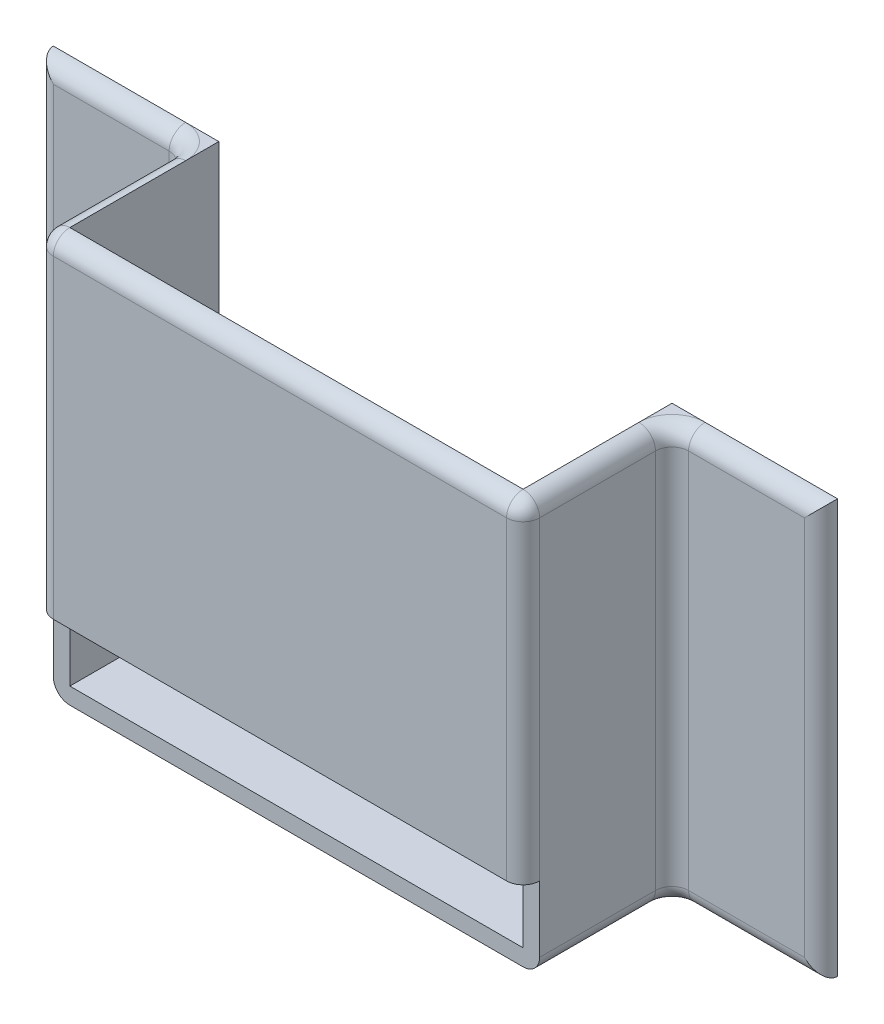
ISO-10303-21;
HEADER;
FILE_DESCRIPTION(('STEP AP214'),'2;1');
FILE_NAME('part.step','',(''),(''),'','','');
FILE_SCHEMA(('AUTOMOTIVE_DESIGN { 1 0 10303 214 1 1 1 1 }'));
ENDSEC;
DATA;
#1=APPLICATION_CONTEXT('core data for automotive mechanical design processes');
#2=APPLICATION_PROTOCOL_DEFINITION('international standard','automotive_design',2000,#1);
#3=PRODUCT_CONTEXT('',#1,'mechanical');
#4=PRODUCT('Part','Part','',(#3));
#5=PRODUCT_RELATED_PRODUCT_CATEGORY('part','',(#4));
#6=PRODUCT_DEFINITION_FORMATION('','',#4);
#7=PRODUCT_DEFINITION_CONTEXT('part definition',#1,'design');
#8=PRODUCT_DEFINITION('design','',#6,#7);
#9=PRODUCT_DEFINITION_SHAPE('','',#8);
#10=(LENGTH_UNIT() NAMED_UNIT(*) SI_UNIT(.MILLI.,.METRE.));
#11=(NAMED_UNIT(*) PLANE_ANGLE_UNIT() SI_UNIT($,.RADIAN.));
#12=(NAMED_UNIT(*) SI_UNIT($,.STERADIAN.) SOLID_ANGLE_UNIT());
#13=UNCERTAINTY_MEASURE_WITH_UNIT(LENGTH_MEASURE(1.E-05),#10,'distance_accuracy_value','');
#14=(GEOMETRIC_REPRESENTATION_CONTEXT(3) GLOBAL_UNCERTAINTY_ASSIGNED_CONTEXT((#13)) GLOBAL_UNIT_ASSIGNED_CONTEXT((#10,
#11,#12)) REPRESENTATION_CONTEXT('',''));
#15=CARTESIAN_POINT('',(0.,0.,0.));
#16=DIRECTION('',(0.,0.,1.));
#17=DIRECTION('',(1.,0.,0.));
#18=AXIS2_PLACEMENT_3D('',#15,#16,#17);
#19=CARTESIAN_POINT('',(-53.4725742168634,-14.9337819884934,2.54));
#20=DIRECTION('',(0.,1.,0.));
#21=DIRECTION('',(0.,0.,1.));
#22=AXIS2_PLACEMENT_3D('',#19,#20,#21);
#23=PLANE('',#22);
#24=CARTESIAN_POINT('',(-33.1525742168634,-14.9337819884934,-17.78));
#25=DIRECTION('',(0.,1.,0.));
#26=DIRECTION('',(0.,0.,1.));
#27=AXIS2_PLACEMENT_3D('',#24,#25,#26);
#28=CIRCLE('',#27,5.08);
#29=CARTESIAN_POINT('',(-33.1525742168634,-14.9337819884934,-22.86));
#30=VERTEX_POINT('',#29);
#31=CARTESIAN_POINT('',(-28.0725742168634,-14.9337819884934,-17.78));
#32=VERTEX_POINT('',#31);
#33=EDGE_CURVE('E356',#30,#32,#28,.F.);
#34=ORIENTED_EDGE('',*,*,#33,.F.);
#35=DIRECTION('',(-1.,0.,0.));
#36=VECTOR('',#35,1.);
#37=CARTESIAN_POINT('',(66.8980257831366,-14.9337819884934,-22.86));
#38=LINE('',#37,#36);
#39=CARTESIAN_POINT('',(46.5780257831366,-14.9337819884934,-22.86));
#40=VERTEX_POINT('',#39);
#41=EDGE_CURVE('E307',#40,#30,#38,.T.);
#42=ORIENTED_EDGE('',*,*,#41,.F.);
#43=CARTESIAN_POINT('',(46.5780257831366,-14.9337819884934,-17.78));
#44=DIRECTION('',(0.,1.,0.));
#45=DIRECTION('',(0.,0.,1.));
#46=AXIS2_PLACEMENT_3D('',#43,#44,#45);
#47=CIRCLE('',#46,5.08);
#48=CARTESIAN_POINT('',(41.4980257831366,-14.9337819884934,-17.78));
#49=VERTEX_POINT('',#48);
#50=EDGE_CURVE('E348',#49,#40,#47,.F.);
#51=ORIENTED_EDGE('',*,*,#50,.F.);
#52=DIRECTION('',(0.,0.,1.));
#53=VECTOR('',#52,1.);
#54=CARTESIAN_POINT('',(41.4980257831366,-14.9337819884934,2.54));
#55=LINE('',#54,#53);
#56=CARTESIAN_POINT('',(41.4980257831366,-14.9337819884934,0.));
#57=VERTEX_POINT('',#56);
#58=EDGE_CURVE('E345',#49,#57,#55,.T.);
#59=ORIENTED_EDGE('',*,*,#58,.T.);
#60=DIRECTION('',(1.,0.,0.));
#61=VECTOR('',#60,1.);
#62=CARTESIAN_POINT('',(-30.6125742168634,-14.9337819884934,0.));
#63=LINE('',#62,#61);
#64=CARTESIAN_POINT('',(-28.0725742168634,-14.9337819884934,0.));
#65=VERTEX_POINT('',#64);
#66=EDGE_CURVE('E351',#57,#65,#63,.F.);
#67=ORIENTED_EDGE('',*,*,#66,.T.);
#68=DIRECTION('',(0.,0.,-1.));
#69=VECTOR('',#68,1.);
#70=CARTESIAN_POINT('',(-28.0725742168634,-14.9337819884934,2.54));
#71=LINE('',#70,#69);
#72=EDGE_CURVE('E354',#65,#32,#71,.T.);
#73=ORIENTED_EDGE('',*,*,#72,.T.);
#74=EDGE_LOOP('',(#34,#42,#51,#59,#67,#73));
#75=FACE_BOUND('',#74,.T.);
#76=ADVANCED_FACE('F35',(#75),#23,.F.);
#77=CARTESIAN_POINT('',(-53.4725742168634,48.5662180115066,2.54));
#78=DIRECTION('',(0.,-1.,0.));
#79=DIRECTION('',(0.,0.,-1.));
#80=AXIS2_PLACEMENT_3D('',#77,#78,#79);
#81=PLANE('',#80);
#82=CARTESIAN_POINT('',(-33.1525742168634,48.5662180115066,-17.78));
#83=DIRECTION('',(0.,-1.,0.));
#84=DIRECTION('',(0.,0.,-1.));
#85=AXIS2_PLACEMENT_3D('',#82,#83,#84);
#86=CIRCLE('',#85,5.08);
#87=CARTESIAN_POINT('',(-28.0725742168634,48.5662180115066,-17.78));
#88=VERTEX_POINT('',#87);
#89=CARTESIAN_POINT('',(-33.1525742168634,48.5662180115066,-22.86));
#90=VERTEX_POINT('',#89);
#91=EDGE_CURVE('E321',#88,#90,#86,.F.);
#92=ORIENTED_EDGE('',*,*,#91,.F.);
#93=DIRECTION('',(0.,0.,1.));
#94=VECTOR('',#93,1.);
#95=CARTESIAN_POINT('',(-28.0725742168634,48.5662180115066,-22.86));
#96=LINE('',#95,#94);
#97=CARTESIAN_POINT('',(-28.0725742168634,48.5662180115066,-22.86));
#98=VERTEX_POINT('',#97);
#99=EDGE_CURVE('E414',#98,#88,#96,.T.);
#100=ORIENTED_EDGE('',*,*,#99,.F.);
#101=DIRECTION('',(1.,0.,0.));
#102=VECTOR('',#101,1.);
#103=CARTESIAN_POINT('',(0.,48.5662180115066,-22.86));
#104=LINE('',#103,#102);
#105=EDGE_CURVE('E423',#90,#98,#104,.T.);
#106=ORIENTED_EDGE('',*,*,#105,.F.);
#107=EDGE_LOOP('',(#92,#100,#106));
#108=FACE_BOUND('',#107,.T.);
#109=ADVANCED_FACE('F475',(#108),#81,.F.);
#110=CARTESIAN_POINT('',(46.5780257831366,48.5662180115066,-17.78));
#111=DIRECTION('',(0.,-1.,0.));
#112=DIRECTION('',(0.,0.,-1.));
#113=AXIS2_PLACEMENT_3D('',#110,#111,#112);
#114=CIRCLE('',#113,5.08);
#115=CARTESIAN_POINT('',(46.5780257831366,48.5662180115066,-22.86));
#116=VERTEX_POINT('',#115);
#117=CARTESIAN_POINT('',(41.4980257831366,48.5662180115066,-17.78));
#118=VERTEX_POINT('',#117);
#119=EDGE_CURVE('E317',#116,#118,#114,.F.);
#120=ORIENTED_EDGE('',*,*,#119,.F.);
#121=DIRECTION('',(1.,0.,0.));
#122=VECTOR('',#121,1.);
#123=CARTESIAN_POINT('',(0.,48.5662180115066,-22.86));
#124=LINE('',#123,#122);
#125=CARTESIAN_POINT('',(41.4980257831366,48.5662180115066,-22.86));
#126=VERTEX_POINT('',#125);
#127=EDGE_CURVE('E408',#126,#116,#124,.T.);
#128=ORIENTED_EDGE('',*,*,#127,.F.);
#129=DIRECTION('',(0.,0.,1.));
#130=VECTOR('',#129,1.);
#131=CARTESIAN_POINT('',(41.4980257831366,48.5662180115066,-22.86));
#132=LINE('',#131,#130);
#133=EDGE_CURVE('E318',#126,#118,#132,.T.);
#134=ORIENTED_EDGE('',*,*,#133,.T.);
#135=EDGE_LOOP('',(#120,#128,#134));
#136=FACE_BOUND('',#135,.T.);
#137=ADVANCED_FACE('F497',(#136),#81,.F.);
#138=CARTESIAN_POINT('',(44.0380257831366,48.5662180115066,2.54));
#139=DIRECTION('',(-1.,0.,0.));
#140=DIRECTION('',(0.,-1.,0.));
#141=AXIS2_PLACEMENT_3D('',#138,#139,#140);
#142=PLANE('',#141);
#143=DIRECTION('',(0.,-1.,0.));
#144=VECTOR('',#143,1.);
#145=CARTESIAN_POINT('',(44.0380257831366,48.5662180115066,-17.78));
#146=LINE('',#145,#144);
#147=CARTESIAN_POINT('',(44.0380257831366,-12.3937819884934,-17.78));
#148=VERTEX_POINT('',#147);
#149=CARTESIAN_POINT('',(44.0380257831366,46.0262180115066,-17.78));
#150=VERTEX_POINT('',#149);
#151=EDGE_CURVE('E225',#148,#150,#146,.F.);
#152=ORIENTED_EDGE('',*,*,#151,.T.);
#153=DIRECTION('',(0.,0.,-1.));
#154=VECTOR('',#153,1.);
#155=CARTESIAN_POINT('',(44.0380257831366,46.0262180115066,2.54));
#156=LINE('',#155,#154);
#157=CARTESIAN_POINT('',(44.0380257831366,46.0262180115066,0.));
#158=VERTEX_POINT('',#157);
#159=EDGE_CURVE('E224',#150,#158,#156,.F.);
#160=ORIENTED_EDGE('',*,*,#159,.T.);
#161=DIRECTION('',(0.,1.,0.));
#162=VECTOR('',#161,1.);
#163=CARTESIAN_POINT('',(44.0380257831366,-14.9337819884934,0.));
#164=LINE('',#163,#162);
#165=CARTESIAN_POINT('',(44.0380257831366,-2.23378198849342,0.));
#166=VERTEX_POINT('',#165);
#167=EDGE_CURVE('E216',#158,#166,#164,.F.);
#168=ORIENTED_EDGE('',*,*,#167,.T.);
#169=DIRECTION('',(0.,-1.,0.));
#170=VECTOR('',#169,1.);
#171=CARTESIAN_POINT('',(44.0380257831366,0.,0.));
#172=LINE('',#171,#170);
#173=CARTESIAN_POINT('',(44.0380257831366,-12.3937819884934,0.));
#174=VERTEX_POINT('',#173);
#175=EDGE_CURVE('E189',#174,#166,#172,.F.);
#176=ORIENTED_EDGE('',*,*,#175,.F.);
#177=DIRECTION('',(0.,0.,1.));
#178=VECTOR('',#177,1.);
#179=CARTESIAN_POINT('',(44.0380257831366,-12.3937819884934,2.54));
#180=LINE('',#179,#178);
#181=EDGE_CURVE('E229',#174,#148,#180,.F.);
#182=ORIENTED_EDGE('',*,*,#181,.T.);
#183=EDGE_LOOP('',(#152,#160,#168,#176,#182));
#184=FACE_BOUND('',#183,.T.);
#185=ADVANCED_FACE('F222',(#184),#142,.F.);
#186=CARTESIAN_POINT('',(-30.6125742168634,48.5662180115066,2.54));
#187=DIRECTION('',(1.,0.,0.));
#188=DIRECTION('',(0.,1.,0.));
#189=AXIS2_PLACEMENT_3D('',#186,#187,#188);
#190=PLANE('',#189);
#191=DIRECTION('',(0.,-1.,0.));
#192=VECTOR('',#191,1.);
#193=CARTESIAN_POINT('',(-30.6125742168634,48.5662180115066,0.));
#194=LINE('',#193,#192);
#195=CARTESIAN_POINT('',(-30.6125742168634,-12.3937819884934,0.));
#196=VERTEX_POINT('',#195);
#197=CARTESIAN_POINT('',(-30.6125742168634,-2.23378198849342,0.));
#198=VERTEX_POINT('',#197);
#199=EDGE_CURVE('E337',#196,#198,#194,.F.);
#200=ORIENTED_EDGE('',*,*,#199,.T.);
#201=CARTESIAN_POINT('',(-30.6125742168634,46.0262180115066,0.));
#202=VERTEX_POINT('',#201);
#203=EDGE_CURVE('E336',#198,#202,#194,.F.);
#204=ORIENTED_EDGE('',*,*,#203,.T.);
#205=DIRECTION('',(0.,0.,-1.));
#206=VECTOR('',#205,1.);
#207=CARTESIAN_POINT('',(-30.6125742168634,46.0262180115066,2.54));
#208=LINE('',#207,#206);
#209=CARTESIAN_POINT('',(-30.6125742168634,46.0262180115066,-17.78));
#210=VERTEX_POINT('',#209);
#211=EDGE_CURVE('E343',#202,#210,#208,.T.);
#212=ORIENTED_EDGE('',*,*,#211,.T.);
#213=DIRECTION('',(0.,-1.,0.));
#214=VECTOR('',#213,1.);
#215=CARTESIAN_POINT('',(-30.6125742168634,-14.9337819884934,-17.78));
#216=LINE('',#215,#214);
#217=CARTESIAN_POINT('',(-30.6125742168634,-12.3937819884934,-17.78));
#218=VERTEX_POINT('',#217);
#219=EDGE_CURVE('E340',#210,#218,#216,.T.);
#220=ORIENTED_EDGE('',*,*,#219,.T.);
#221=DIRECTION('',(0.,0.,-1.));
#222=VECTOR('',#221,1.);
#223=CARTESIAN_POINT('',(-30.6125742168634,-12.3937819884934,2.54));
#224=LINE('',#223,#222);
#225=EDGE_CURVE('E333',#218,#196,#224,.F.);
#226=ORIENTED_EDGE('',*,*,#225,.T.);
#227=EDGE_LOOP('',(#200,#204,#212,#220,#226));
#228=FACE_BOUND('',#227,.T.);
#229=ADVANCED_FACE('F709',(#228),#190,.F.);
#230=CARTESIAN_POINT('',(0.,0.,2.54));
#231=DIRECTION('',(0.,0.,1.));
#232=DIRECTION('',(1.,0.,0.));
#233=AXIS2_PLACEMENT_3D('',#230,#231,#232);
#234=PLANE('',#233);
#235=DIRECTION('',(-1.,0.,0.));
#236=VECTOR('',#235,1.);
#237=CARTESIAN_POINT('',(-61.5325088669678,-2.23378198849342,2.54));
#238=LINE('',#237,#236);
#239=CARTESIAN_POINT('',(41.4980257831365,-2.23378198849342,2.54));
#240=VERTEX_POINT('',#239);
#241=CARTESIAN_POINT('',(-28.0725742168634,-2.23378198849342,2.54));
#242=VERTEX_POINT('',#241);
#243=EDGE_CURVE('E396',#240,#242,#238,.T.);
#244=ORIENTED_EDGE('',*,*,#243,.F.);
#245=DIRECTION('',(0.,1.,0.));
#246=VECTOR('',#245,1.);
#247=CARTESIAN_POINT('',(41.4980257831366,48.5662180115066,2.54));
#248=LINE('',#247,#246);
#249=CARTESIAN_POINT('',(41.4980257831366,46.0262180115066,2.54));
#250=VERTEX_POINT('',#249);
#251=EDGE_CURVE('E218',#240,#250,#248,.T.);
#252=ORIENTED_EDGE('',*,*,#251,.T.);
#253=DIRECTION('',(-1.,0.,0.));
#254=VECTOR('',#253,1.);
#255=CARTESIAN_POINT('',(-30.6125742168634,46.0262180115066,2.54));
#256=LINE('',#255,#254);
#257=CARTESIAN_POINT('',(-28.0725742168634,46.0262180115066,2.54));
#258=VERTEX_POINT('',#257);
#259=EDGE_CURVE('E363',#250,#258,#256,.T.);
#260=ORIENTED_EDGE('',*,*,#259,.T.);
#261=DIRECTION('',(0.,-1.,0.));
#262=VECTOR('',#261,1.);
#263=CARTESIAN_POINT('',(-28.0725742168634,-14.9337819884934,2.54));
#264=LINE('',#263,#262);
#265=EDGE_CURVE('E359',#258,#242,#264,.T.);
#266=ORIENTED_EDGE('',*,*,#265,.T.);
#267=EDGE_LOOP('',(#244,#252,#260,#266));
#268=FACE_BOUND('',#267,.T.);
#269=ADVANCED_FACE('F395',(#268),#234,.T.);
#270=CARTESIAN_POINT('',(0.,0.,0.));
#271=DIRECTION('',(0.,0.,1.));
#272=DIRECTION('',(1.,0.,0.));
#273=AXIS2_PLACEMENT_3D('',#270,#271,#272);
#274=PLANE('',#273);
#275=DIRECTION('',(0.,-1.,0.));
#276=VECTOR('',#275,1.);
#277=CARTESIAN_POINT('',(41.4980257831366,0.,0.));
#278=LINE('',#277,#276);
#279=CARTESIAN_POINT('',(41.4980257831366,48.5662180115066,0.));
#280=VERTEX_POINT('',#279);
#281=CARTESIAN_POINT('',(41.4980257831365,-2.23378198849342,0.));
#282=VERTEX_POINT('',#281);
#283=EDGE_CURVE('E407',#280,#282,#278,.T.);
#284=ORIENTED_EDGE('',*,*,#283,.T.);
#285=DIRECTION('',(-1.,0.,0.));
#286=VECTOR('',#285,1.);
#287=CARTESIAN_POINT('',(-61.5325088669678,-2.23378198849342,0.));
#288=LINE('',#287,#286);
#289=CARTESIAN_POINT('',(-28.0725742168634,-2.23378198849342,0.));
#290=VERTEX_POINT('',#289);
#291=EDGE_CURVE('E208',#282,#290,#288,.T.);
#292=ORIENTED_EDGE('',*,*,#291,.T.);
#293=DIRECTION('',(0.,-1.,0.));
#294=VECTOR('',#293,1.);
#295=CARTESIAN_POINT('',(-28.0725742168634,0.,0.));
#296=LINE('',#295,#294);
#297=CARTESIAN_POINT('',(-28.0725742168634,48.5662180115066,0.));
#298=VERTEX_POINT('',#297);
#299=EDGE_CURVE('E427',#298,#290,#296,.T.);
#300=ORIENTED_EDGE('',*,*,#299,.F.);
#301=DIRECTION('',(-1.,0.,0.));
#302=VECTOR('',#301,1.);
#303=CARTESIAN_POINT('',(-53.4725742168634,48.5662180115066,0.));
#304=LINE('',#303,#302);
#305=EDGE_CURVE('E314',#280,#298,#304,.T.);
#306=ORIENTED_EDGE('',*,*,#305,.F.);
#307=EDGE_LOOP('',(#284,#292,#300,#306));
#308=FACE_BOUND('',#307,.T.);
#309=ADVANCED_FACE('F732',(#308),#274,.F.);
#310=CARTESIAN_POINT('',(41.4980257831366,0.,-22.86));
#311=DIRECTION('',(-1.,0.,0.));
#312=DIRECTION('',(0.,-1.,0.));
#313=AXIS2_PLACEMENT_3D('',#310,#311,#312);
#314=PLANE('',#313);
#315=ORIENTED_EDGE('',*,*,#283,.F.);
#316=EDGE_CURVE('E385',#118,#280,#132,.T.);
#317=ORIENTED_EDGE('',*,*,#316,.F.);
#318=ORIENTED_EDGE('',*,*,#133,.F.);
#319=DIRECTION('',(0.,-1.,0.));
#320=VECTOR('',#319,1.);
#321=CARTESIAN_POINT('',(41.4980257831366,0.,-22.86));
#322=LINE('',#321,#320);
#323=CARTESIAN_POINT('',(41.4980257831366,-12.3937819884934,-22.86));
#324=VERTEX_POINT('',#323);
#325=EDGE_CURVE('E403',#126,#324,#322,.T.);
#326=ORIENTED_EDGE('',*,*,#325,.T.);
#327=DIRECTION('',(0.,0.,1.));
#328=VECTOR('',#327,1.);
#329=CARTESIAN_POINT('',(41.4980257831366,-12.3937819884934,-22.86));
#330=LINE('',#329,#328);
#331=CARTESIAN_POINT('',(41.4980257831366,-12.3937819884934,0.));
#332=VERTEX_POINT('',#331);
#333=EDGE_CURVE('E411',#324,#332,#330,.T.);
#334=ORIENTED_EDGE('',*,*,#333,.T.);
#335=DIRECTION('',(0.,-1.,0.));
#336=VECTOR('',#335,1.);
#337=CARTESIAN_POINT('',(41.4980257831366,0.,0.));
#338=LINE('',#337,#336);
#339=EDGE_CURVE('E220',#282,#332,#338,.T.);
#340=ORIENTED_EDGE('',*,*,#339,.F.);
#341=EDGE_LOOP('',(#315,#317,#318,#326,#334,#340));
#342=FACE_BOUND('',#341,.T.);
#343=ADVANCED_FACE('F494',(#342),#314,.T.);
#344=CARTESIAN_POINT('',(0.,0.,-22.86));
#345=DIRECTION('',(0.,0.,-1.));
#346=DIRECTION('',(-1.,0.,0.));
#347=AXIS2_PLACEMENT_3D('',#344,#345,#346);
#348=PLANE('',#347);
#349=DIRECTION('',(0.,-1.,0.));
#350=VECTOR('',#349,1.);
#351=CARTESIAN_POINT('',(-53.4725742168634,-12.3937819884934,-22.86));
#352=LINE('',#351,#350);
#353=CARTESIAN_POINT('',(-53.4725742168634,48.5662180115066,-22.86));
#354=VERTEX_POINT('',#353);
#355=CARTESIAN_POINT('',(-53.4725742168634,-14.9337819884934,-22.86));
#356=VERTEX_POINT('',#355);
#357=EDGE_CURVE('E436',#354,#356,#352,.T.);
#358=ORIENTED_EDGE('',*,*,#357,.F.);
#359=EDGE_CURVE('E419',#354,#90,#104,.T.);
#360=ORIENTED_EDGE('',*,*,#359,.T.);
#361=ORIENTED_EDGE('',*,*,#105,.T.);
#362=DIRECTION('',(0.,-1.,0.));
#363=VECTOR('',#362,1.);
#364=CARTESIAN_POINT('',(-28.0725742168634,0.,-22.86));
#365=LINE('',#364,#363);
#366=CARTESIAN_POINT('',(-28.0725742168634,-12.3937819884934,-22.86));
#367=VERTEX_POINT('',#366);
#368=EDGE_CURVE('E422',#98,#367,#365,.T.);
#369=ORIENTED_EDGE('',*,*,#368,.T.);
#370=DIRECTION('',(-1.,0.,0.));
#371=VECTOR('',#370,1.);
#372=CARTESIAN_POINT('',(66.8980257831366,-12.3937819884934,-22.86));
#373=LINE('',#372,#371);
#374=EDGE_CURVE('E438',#324,#367,#373,.T.);
#375=ORIENTED_EDGE('',*,*,#374,.F.);
#376=ORIENTED_EDGE('',*,*,#325,.F.);
#377=ORIENTED_EDGE('',*,*,#127,.T.);
#378=CARTESIAN_POINT('',(66.8980257831366,48.5662180115066,-22.86));
#379=VERTEX_POINT('',#378);
#380=EDGE_CURVE('E406',#116,#379,#124,.T.);
#381=ORIENTED_EDGE('',*,*,#380,.T.);
#382=DIRECTION('',(0.,-1.,0.));
#383=VECTOR('',#382,1.);
#384=CARTESIAN_POINT('',(66.8980257831366,-12.3937819884934,-22.86));
#385=LINE('',#384,#383);
#386=CARTESIAN_POINT('',(66.8980257831366,-14.9337819884934,-22.86));
#387=VERTEX_POINT('',#386);
#388=EDGE_CURVE('E312',#379,#387,#385,.T.);
#389=ORIENTED_EDGE('',*,*,#388,.T.);
#390=EDGE_CURVE('E309',#387,#40,#38,.T.);
#391=ORIENTED_EDGE('',*,*,#390,.T.);
#392=ORIENTED_EDGE('',*,*,#41,.T.);
#393=EDGE_CURVE('E303',#30,#356,#38,.T.);
#394=ORIENTED_EDGE('',*,*,#393,.T.);
#395=EDGE_LOOP('',(#358,#360,#361,#369,#375,#376,#377,#381,#389,#391,#392,#394));
#396=FACE_BOUND('',#395,.T.);
#397=ADVANCED_FACE('F444',(#396),#348,.T.);
#398=CARTESIAN_POINT('',(-28.0725742168634,0.,-22.86));
#399=DIRECTION('',(-1.,0.,0.));
#400=DIRECTION('',(0.,-1.,0.));
#401=AXIS2_PLACEMENT_3D('',#398,#399,#400);
#402=PLANE('',#401);
#403=ORIENTED_EDGE('',*,*,#299,.T.);
#404=DIRECTION('',(0.,-1.,0.));
#405=VECTOR('',#404,1.);
#406=CARTESIAN_POINT('',(-28.0725742168634,0.,0.));
#407=LINE('',#406,#405);
#408=CARTESIAN_POINT('',(-28.0725742168634,-12.3937819884934,0.));
#409=VERTEX_POINT('',#408);
#410=EDGE_CURVE('E199',#290,#409,#407,.T.);
#411=ORIENTED_EDGE('',*,*,#410,.T.);
#412=DIRECTION('',(0.,0.,1.));
#413=VECTOR('',#412,1.);
#414=CARTESIAN_POINT('',(-28.0725742168634,-12.3937819884934,-22.86));
#415=LINE('',#414,#413);
#416=EDGE_CURVE('E426',#367,#409,#415,.T.);
#417=ORIENTED_EDGE('',*,*,#416,.F.);
#418=ORIENTED_EDGE('',*,*,#368,.F.);
#419=ORIENTED_EDGE('',*,*,#99,.T.);
#420=EDGE_CURVE('E432',#88,#298,#96,.T.);
#421=ORIENTED_EDGE('',*,*,#420,.T.);
#422=EDGE_LOOP('',(#403,#411,#417,#418,#419,#421));
#423=FACE_BOUND('',#422,.T.);
#424=ADVANCED_FACE('F478',(#423),#402,.F.);
#425=CARTESIAN_POINT('',(66.8980257831366,-12.3937819884934,-22.86));
#426=DIRECTION('',(0.,1.,0.));
#427=DIRECTION('',(0.,0.,1.));
#428=AXIS2_PLACEMENT_3D('',#425,#426,#427);
#429=PLANE('',#428);
#430=ORIENTED_EDGE('',*,*,#333,.F.);
#431=ORIENTED_EDGE('',*,*,#374,.T.);
#432=ORIENTED_EDGE('',*,*,#416,.T.);
#433=DIRECTION('',(-1.,0.,0.));
#434=VECTOR('',#433,1.);
#435=CARTESIAN_POINT('',(66.8980257831366,-12.3937819884934,0.));
#436=LINE('',#435,#434);
#437=EDGE_CURVE('E299',#332,#409,#436,.T.);
#438=ORIENTED_EDGE('',*,*,#437,.F.);
#439=EDGE_LOOP('',(#430,#431,#432,#438));
#440=FACE_BOUND('',#439,.T.);
#441=ADVANCED_FACE('F490',(#440),#429,.T.);
#442=CARTESIAN_POINT('',(-53.4725742168634,48.5662180115066,-20.32));
#443=DIRECTION('',(0.,0.,-1.));
#444=DIRECTION('',(-1.,0.,0.));
#445=AXIS2_PLACEMENT_3D('',#442,#443,#444);
#446=PLANE('',#445);
#447=DIRECTION('',(0.,-1.,0.));
#448=VECTOR('',#447,1.);
#449=CARTESIAN_POINT('',(-33.1525742168634,48.5662180115066,-20.32));
#450=LINE('',#449,#448);
#451=CARTESIAN_POINT('',(-33.1525742168634,-12.3937819884934,-20.32));
#452=VERTEX_POINT('',#451);
#453=CARTESIAN_POINT('',(-33.1525742168634,46.0262180115066,-20.32));
#454=VERTEX_POINT('',#453);
#455=EDGE_CURVE('E328',#452,#454,#450,.F.);
#456=ORIENTED_EDGE('',*,*,#455,.T.);
#457=DIRECTION('',(1.,0.,0.));
#458=VECTOR('',#457,1.);
#459=CARTESIAN_POINT('',(-53.4725742168634,46.0262180115066,-20.32));
#460=LINE('',#459,#458);
#461=CARTESIAN_POINT('',(-50.9325742168634,46.0262180115066,-20.32));
#462=VERTEX_POINT('',#461);
#463=EDGE_CURVE('E330',#454,#462,#460,.F.);
#464=ORIENTED_EDGE('',*,*,#463,.T.);
#465=DIRECTION('',(0.,-1.,0.));
#466=VECTOR('',#465,1.);
#467=CARTESIAN_POINT('',(-50.9325742168634,48.5662180115066,-20.32));
#468=LINE('',#467,#466);
#469=CARTESIAN_POINT('',(-50.9325742168634,-12.3937819884934,-20.32));
#470=VERTEX_POINT('',#469);
#471=EDGE_CURVE('E324',#462,#470,#468,.T.);
#472=ORIENTED_EDGE('',*,*,#471,.T.);
#473=DIRECTION('',(-1.,0.,0.));
#474=VECTOR('',#473,1.);
#475=CARTESIAN_POINT('',(-53.4725742168634,-12.3937819884934,-20.32));
#476=LINE('',#475,#474);
#477=EDGE_CURVE('E326',#470,#452,#476,.F.);
#478=ORIENTED_EDGE('',*,*,#477,.T.);
#479=EDGE_LOOP('',(#456,#464,#472,#478));
#480=FACE_BOUND('',#479,.T.);
#481=ADVANCED_FACE('F766',(#480),#446,.F.);
#482=CARTESIAN_POINT('',(66.8980257831366,48.5662180115066,-20.32));
#483=DIRECTION('',(0.,0.,-1.));
#484=DIRECTION('',(-1.,0.,0.));
#485=AXIS2_PLACEMENT_3D('',#482,#483,#484);
#486=PLANE('',#485);
#487=DIRECTION('',(1.,0.,0.));
#488=VECTOR('',#487,1.);
#489=CARTESIAN_POINT('',(66.8980257831366,46.0262180115066,-20.32));
#490=LINE('',#489,#488);
#491=CARTESIAN_POINT('',(64.3580257831366,46.0262180115066,-20.32));
#492=VERTEX_POINT('',#491);
#493=CARTESIAN_POINT('',(46.5780257831366,46.0262180115066,-20.32));
#494=VERTEX_POINT('',#493);
#495=EDGE_CURVE('E50',#492,#494,#490,.F.);
#496=ORIENTED_EDGE('',*,*,#495,.T.);
#497=DIRECTION('',(0.,-1.,0.));
#498=VECTOR('',#497,1.);
#499=CARTESIAN_POINT('',(46.5780257831366,-14.9337819884934,-20.32));
#500=LINE('',#499,#498);
#501=CARTESIAN_POINT('',(46.5780257831366,-12.3937819884934,-20.32));
#502=VERTEX_POINT('',#501);
#503=EDGE_CURVE('E43',#494,#502,#500,.T.);
#504=ORIENTED_EDGE('',*,*,#503,.T.);
#505=DIRECTION('',(-1.,0.,0.));
#506=VECTOR('',#505,1.);
#507=CARTESIAN_POINT('',(66.8980257831366,-12.3937819884934,-20.32));
#508=LINE('',#507,#506);
#509=CARTESIAN_POINT('',(64.3580257831366,-12.3937819884934,-20.32));
#510=VERTEX_POINT('',#509);
#511=EDGE_CURVE('E227',#502,#510,#508,.F.);
#512=ORIENTED_EDGE('',*,*,#511,.T.);
#513=DIRECTION('',(0.,-1.,0.));
#514=VECTOR('',#513,1.);
#515=CARTESIAN_POINT('',(64.3580257831366,48.5662180115066,-20.32));
#516=LINE('',#515,#514);
#517=EDGE_CURVE('E55',#510,#492,#516,.F.);
#518=ORIENTED_EDGE('',*,*,#517,.T.);
#519=EDGE_LOOP('',(#496,#504,#512,#518));
#520=FACE_BOUND('',#519,.T.);
#521=ADVANCED_FACE('F507',(#520),#486,.F.);
#522=CARTESIAN_POINT('',(-53.4725742168634,-12.3937819884934,-22.86));
#523=DIRECTION('',(-1.,0.,0.));
#524=DIRECTION('',(0.,0.,1.));
#525=AXIS2_PLACEMENT_3D('',#522,#523,#524);
#526=CYLINDRICAL_SURFACE('',#525,2.54);
#527=CARTESIAN_POINT('',(46.5780257831366,-12.3937819884934,-22.86));
#528=DIRECTION('',(-1.,0.,0.));
#529=DIRECTION('',(0.,0.,1.));
#530=AXIS2_PLACEMENT_3D('',#527,#528,#529);
#531=CIRCLE('',#530,2.54);
#532=EDGE_CURVE('E295',#40,#502,#531,.T.);
#533=ORIENTED_EDGE('',*,*,#532,.F.);
#534=ORIENTED_EDGE('',*,*,#390,.F.);
#535=CARTESIAN_POINT('',(64.3580257831366,-12.3937819884934,-22.86));
#536=DIRECTION('',(-0.707106781186547,-0.707106781186548,0.));
#537=DIRECTION('',(-0.707106781186548,0.707106781186547,0.));
#538=AXIS2_PLACEMENT_3D('',#535,#536,#537);
#539=ELLIPSE('',#538,3.59210244842766,2.54);
#540=EDGE_CURVE('E297',#510,#387,#539,.F.);
#541=ORIENTED_EDGE('',*,*,#540,.F.);
#542=ORIENTED_EDGE('',*,*,#511,.F.);
#543=EDGE_LOOP('',(#533,#534,#541,#542));
#544=FACE_BOUND('',#543,.T.);
#545=ADVANCED_FACE('F37',(#544),#526,.T.);
#546=CARTESIAN_POINT('',(64.3580257831366,48.5662180115066,-22.86));
#547=DIRECTION('',(0.,-1.,0.));
#548=DIRECTION('',(1.,0.,0.));
#549=AXIS2_PLACEMENT_3D('',#546,#547,#548);
#550=CYLINDRICAL_SURFACE('',#549,2.54);
#551=ORIENTED_EDGE('',*,*,#540,.T.);
#552=ORIENTED_EDGE('',*,*,#388,.F.);
#553=CARTESIAN_POINT('',(64.3580257831366,46.0262180115066,-22.86));
#554=DIRECTION('',(0.707106781186548,-0.707106781186547,0.));
#555=DIRECTION('',(-0.707106781186547,-0.707106781186548,0.));
#556=AXIS2_PLACEMENT_3D('',#553,#554,#555);
#557=ELLIPSE('',#556,3.59210244842766,2.54);
#558=EDGE_CURVE('E292',#492,#379,#557,.F.);
#559=ORIENTED_EDGE('',*,*,#558,.F.);
#560=ORIENTED_EDGE('',*,*,#517,.F.);
#561=EDGE_LOOP('',(#551,#552,#559,#560));
#562=FACE_BOUND('',#561,.T.);
#563=ADVANCED_FACE('F500',(#562),#550,.T.);
#564=CARTESIAN_POINT('',(46.5780257831366,-12.3937819884934,-17.78));
#565=DIRECTION('',(0.,1.,0.));
#566=DIRECTION('',(0.,0.,1.));
#567=AXIS2_PLACEMENT_3D('',#564,#565,#566);
#568=TOROIDAL_SURFACE('',#567,5.08,2.54);
#569=ORIENTED_EDGE('',*,*,#50,.T.);
#570=ORIENTED_EDGE('',*,*,#532,.T.);
#571=CARTESIAN_POINT('',(46.5780257831366,-12.3937819884934,-17.78));
#572=DIRECTION('',(0.,1.,0.));
#573=DIRECTION('',(0.,0.,1.));
#574=AXIS2_PLACEMENT_3D('',#571,#572,#573);
#575=CIRCLE('',#574,2.54);
#576=EDGE_CURVE('E290',#148,#502,#575,.F.);
#577=ORIENTED_EDGE('',*,*,#576,.F.);
#578=CARTESIAN_POINT('',(41.4980257831366,-12.3937819884934,-17.78));
#579=DIRECTION('',(0.,0.,-1.));
#580=DIRECTION('',(-1.,0.,0.));
#581=AXIS2_PLACEMENT_3D('',#578,#579,#580);
#582=CIRCLE('',#581,2.54);
#583=EDGE_CURVE('E287',#49,#148,#582,.F.);
#584=ORIENTED_EDGE('',*,*,#583,.F.);
#585=EDGE_LOOP('',(#569,#570,#577,#584));
#586=FACE_BOUND('',#585,.T.);
#587=ADVANCED_FACE('F373',(#586),#568,.T.);
#588=CARTESIAN_POINT('',(-53.4725742168634,46.0262180115066,-22.86));
#589=DIRECTION('',(1.,0.,0.));
#590=DIRECTION('',(0.,0.,-1.));
#591=AXIS2_PLACEMENT_3D('',#588,#589,#590);
#592=CYLINDRICAL_SURFACE('',#591,2.54);
#593=ORIENTED_EDGE('',*,*,#558,.T.);
#594=ORIENTED_EDGE('',*,*,#380,.F.);
#595=CARTESIAN_POINT('',(46.5780257831366,46.0262180115066,-22.86));
#596=DIRECTION('',(-1.,0.,0.));
#597=DIRECTION('',(0.,0.,1.));
#598=AXIS2_PLACEMENT_3D('',#595,#596,#597);
#599=CIRCLE('',#598,2.54);
#600=EDGE_CURVE('E284',#494,#116,#599,.T.);
#601=ORIENTED_EDGE('',*,*,#600,.F.);
#602=ORIENTED_EDGE('',*,*,#495,.F.);
#603=EDGE_LOOP('',(#593,#594,#601,#602));
#604=FACE_BOUND('',#603,.T.);
#605=ADVANCED_FACE('F499',(#604),#592,.T.);
#606=CARTESIAN_POINT('',(46.5780257831366,48.5662180115066,-17.78));
#607=DIRECTION('',(0.,1.,0.));
#608=DIRECTION('',(-1.,0.,0.));
#609=AXIS2_PLACEMENT_3D('',#606,#607,#608);
#610=CYLINDRICAL_SURFACE('',#609,2.54);
#611=ORIENTED_EDGE('',*,*,#576,.T.);
#612=ORIENTED_EDGE('',*,*,#503,.F.);
#613=CARTESIAN_POINT('',(46.5780257831366,46.0262180115066,-17.78));
#614=DIRECTION('',(0.,-1.,0.));
#615=DIRECTION('',(0.,0.,-1.));
#616=AXIS2_PLACEMENT_3D('',#613,#614,#615);
#617=CIRCLE('',#616,2.54);
#618=EDGE_CURVE('E281',#150,#494,#617,.T.);
#619=ORIENTED_EDGE('',*,*,#618,.F.);
#620=ORIENTED_EDGE('',*,*,#151,.F.);
#621=EDGE_LOOP('',(#611,#612,#619,#620));
#622=FACE_BOUND('',#621,.T.);
#623=ADVANCED_FACE('F377',(#622),#610,.F.);
#624=CARTESIAN_POINT('',(41.4980257831366,-12.3937819884934,2.54));
#625=DIRECTION('',(0.,0.,1.));
#626=DIRECTION('',(1.,0.,0.));
#627=AXIS2_PLACEMENT_3D('',#624,#625,#626);
#628=CYLINDRICAL_SURFACE('',#627,2.54);
#629=ORIENTED_EDGE('',*,*,#583,.T.);
#630=ORIENTED_EDGE('',*,*,#181,.F.);
#631=CARTESIAN_POINT('',(41.4980257831366,-12.3937819884934,0.));
#632=DIRECTION('',(0.,0.,1.));
#633=DIRECTION('',(1.,0.,0.));
#634=AXIS2_PLACEMENT_3D('',#631,#632,#633);
#635=CIRCLE('',#634,2.54);
#636=EDGE_CURVE('E195',#57,#174,#635,.T.);
#637=ORIENTED_EDGE('',*,*,#636,.F.);
#638=ORIENTED_EDGE('',*,*,#58,.F.);
#639=EDGE_LOOP('',(#629,#630,#637,#638));
#640=FACE_BOUND('',#639,.T.);
#641=ADVANCED_FACE('F371',(#640),#628,.T.);
#642=CARTESIAN_POINT('',(46.5780257831366,46.0262180115066,-17.78));
#643=DIRECTION('',(0.,-1.,0.));
#644=DIRECTION('',(0.,0.,-1.));
#645=AXIS2_PLACEMENT_3D('',#642,#643,#644);
#646=TOROIDAL_SURFACE('',#645,5.08,2.54);
#647=ORIENTED_EDGE('',*,*,#600,.T.);
#648=ORIENTED_EDGE('',*,*,#119,.T.);
#649=CARTESIAN_POINT('',(41.4980257831366,46.0262180115066,-17.78));
#650=DIRECTION('',(0.,0.,-1.));
#651=DIRECTION('',(-1.,0.,0.));
#652=AXIS2_PLACEMENT_3D('',#649,#650,#651);
#653=CIRCLE('',#652,2.54);
#654=EDGE_CURVE('E277',#150,#118,#653,.F.);
#655=ORIENTED_EDGE('',*,*,#654,.F.);
#656=ORIENTED_EDGE('',*,*,#618,.T.);
#657=EDGE_LOOP('',(#647,#648,#655,#656));
#658=FACE_BOUND('',#657,.T.);
#659=ADVANCED_FACE('F381',(#658),#646,.T.);
#660=CARTESIAN_POINT('',(41.4980257831366,46.0262180115066,2.54));
#661=DIRECTION('',(0.,0.,-1.));
#662=DIRECTION('',(-1.,0.,0.));
#663=AXIS2_PLACEMENT_3D('',#660,#661,#662);
#664=CYLINDRICAL_SURFACE('',#663,2.54);
#665=ORIENTED_EDGE('',*,*,#654,.T.);
#666=ORIENTED_EDGE('',*,*,#316,.T.);
#667=CARTESIAN_POINT('',(41.4980257831366,46.0262180115066,0.));
#668=DIRECTION('',(0.,0.,1.));
#669=DIRECTION('',(1.,0.,0.));
#670=AXIS2_PLACEMENT_3D('',#667,#668,#669);
#671=CIRCLE('',#670,2.54);
#672=EDGE_CURVE('E274',#158,#280,#671,.T.);
#673=ORIENTED_EDGE('',*,*,#672,.F.);
#674=ORIENTED_EDGE('',*,*,#159,.F.);
#675=EDGE_LOOP('',(#665,#666,#673,#674));
#676=FACE_BOUND('',#675,.T.);
#677=ADVANCED_FACE('F384',(#676),#664,.T.);
#678=CARTESIAN_POINT('',(41.4980257831366,0.,0.));
#679=DIRECTION('',(0.,-1.,0.));
#680=DIRECTION('',(1.,0.,0.));
#681=AXIS2_PLACEMENT_3D('',#678,#679,#680);
#682=CYLINDRICAL_SURFACE('',#681,2.54);
#683=CARTESIAN_POINT('',(41.4980257831366,-2.23378198849342,0.));
#684=DIRECTION('',(0.,1.,0.));
#685=DIRECTION('',(0.,0.,1.));
#686=AXIS2_PLACEMENT_3D('',#683,#684,#685);
#687=CIRCLE('',#686,2.54);
#688=EDGE_CURVE('E204',#166,#240,#687,.F.);
#689=ORIENTED_EDGE('',*,*,#688,.F.);
#690=ORIENTED_EDGE('',*,*,#167,.F.);
#691=CARTESIAN_POINT('',(41.4980257831366,46.0262180115066,0.));
#692=DIRECTION('',(0.,1.,0.));
#693=DIRECTION('',(0.,0.,1.));
#694=AXIS2_PLACEMENT_3D('',#691,#692,#693);
#695=CIRCLE('',#694,2.54);
#696=EDGE_CURVE('E271',#250,#158,#695,.T.);
#697=ORIENTED_EDGE('',*,*,#696,.F.);
#698=ORIENTED_EDGE('',*,*,#251,.F.);
#699=EDGE_LOOP('',(#689,#690,#697,#698));
#700=FACE_BOUND('',#699,.T.);
#701=ADVANCED_FACE('F214',(#700),#682,.T.);
#702=CARTESIAN_POINT('',(41.4980257831366,46.0262180115066,0.));
#703=DIRECTION('',(0.,0.,1.));
#704=DIRECTION('',(1.,0.,0.));
#705=AXIS2_PLACEMENT_3D('',#702,#703,#704);
#706=SPHERICAL_SURFACE('',#705,2.54);
#707=ORIENTED_EDGE('',*,*,#696,.T.);
#708=ORIENTED_EDGE('',*,*,#672,.T.);
#709=CARTESIAN_POINT('',(41.4980257831366,46.0262180115066,0.));
#710=DIRECTION('',(1.,0.,0.));
#711=DIRECTION('',(0.,0.,-1.));
#712=AXIS2_PLACEMENT_3D('',#709,#710,#711);
#713=CIRCLE('',#712,2.54);
#714=EDGE_CURVE('E268',#250,#280,#713,.F.);
#715=ORIENTED_EDGE('',*,*,#714,.F.);
#716=EDGE_LOOP('',(#707,#708,#715));
#717=FACE_BOUND('',#716,.T.);
#718=ADVANCED_FACE('F388',(#717),#706,.T.);
#719=CARTESIAN_POINT('',(0.,46.0262180115066,0.));
#720=DIRECTION('',(1.,0.,0.));
#721=DIRECTION('',(0.,0.,-1.));
#722=AXIS2_PLACEMENT_3D('',#719,#720,#721);
#723=CYLINDRICAL_SURFACE('',#722,2.54);
#724=ORIENTED_EDGE('',*,*,#714,.T.);
#725=ORIENTED_EDGE('',*,*,#305,.T.);
#726=CARTESIAN_POINT('',(-28.0725742168634,46.0262180115066,0.));
#727=DIRECTION('',(-1.,0.,0.));
#728=DIRECTION('',(0.,0.,1.));
#729=AXIS2_PLACEMENT_3D('',#726,#727,#728);
#730=CIRCLE('',#729,2.54);
#731=EDGE_CURVE('E262',#258,#298,#730,.T.);
#732=ORIENTED_EDGE('',*,*,#731,.F.);
#733=ORIENTED_EDGE('',*,*,#259,.F.);
#734=EDGE_LOOP('',(#724,#725,#732,#733));
#735=FACE_BOUND('',#734,.T.);
#736=ADVANCED_FACE('F392',(#735),#723,.T.);
#737=CARTESIAN_POINT('',(-28.0725742168634,0.,0.));
#738=DIRECTION('',(0.,1.,0.));
#739=DIRECTION('',(-1.,0.,0.));
#740=AXIS2_PLACEMENT_3D('',#737,#738,#739);
#741=CYLINDRICAL_SURFACE('',#740,2.54);
#742=CARTESIAN_POINT('',(-28.0725742168634,-2.23378198849342,0.));
#743=DIRECTION('',(0.,1.,0.));
#744=DIRECTION('',(0.,0.,1.));
#745=AXIS2_PLACEMENT_3D('',#742,#743,#744);
#746=CIRCLE('',#745,2.54);
#747=EDGE_CURVE('E11',#242,#198,#746,.F.);
#748=ORIENTED_EDGE('',*,*,#747,.F.);
#749=ORIENTED_EDGE('',*,*,#265,.F.);
#750=CARTESIAN_POINT('',(-28.0725742168634,46.0262180115066,0.));
#751=DIRECTION('',(0.,1.,0.));
#752=DIRECTION('',(0.,0.,1.));
#753=AXIS2_PLACEMENT_3D('',#750,#751,#752);
#754=CIRCLE('',#753,2.54);
#755=EDGE_CURVE('E260',#202,#258,#754,.T.);
#756=ORIENTED_EDGE('',*,*,#755,.F.);
#757=ORIENTED_EDGE('',*,*,#203,.F.);
#758=EDGE_LOOP('',(#748,#749,#756,#757));
#759=FACE_BOUND('',#758,.T.);
#760=ADVANCED_FACE('F489',(#759),#741,.T.);
#761=CARTESIAN_POINT('',(-28.0725742168634,-12.3937819884934,2.54));
#762=DIRECTION('',(0.,0.,-1.));
#763=DIRECTION('',(-1.,0.,0.));
#764=AXIS2_PLACEMENT_3D('',#761,#762,#763);
#765=CYLINDRICAL_SURFACE('',#764,2.54);
#766=CARTESIAN_POINT('',(-28.0725742168634,-12.3937819884934,0.));
#767=DIRECTION('',(0.,0.,1.));
#768=DIRECTION('',(1.,0.,0.));
#769=AXIS2_PLACEMENT_3D('',#766,#767,#768);
#770=CIRCLE('',#769,2.54);
#771=EDGE_CURVE('E265',#65,#196,#770,.F.);
#772=ORIENTED_EDGE('',*,*,#771,.T.);
#773=ORIENTED_EDGE('',*,*,#225,.F.);
#774=CARTESIAN_POINT('',(-28.0725742168634,-12.3937819884934,-17.78));
#775=DIRECTION('',(0.,0.,-1.));
#776=DIRECTION('',(-1.,0.,0.));
#777=AXIS2_PLACEMENT_3D('',#774,#775,#776);
#778=CIRCLE('',#777,2.54);
#779=EDGE_CURVE('E257',#32,#218,#778,.T.);
#780=ORIENTED_EDGE('',*,*,#779,.F.);
#781=ORIENTED_EDGE('',*,*,#72,.F.);
#782=EDGE_LOOP('',(#772,#773,#780,#781));
#783=FACE_BOUND('',#782,.T.);
#784=ADVANCED_FACE('F534',(#783),#765,.T.);
#785=CARTESIAN_POINT('',(-28.0725742168634,46.0262180115066,0.));
#786=DIRECTION('',(0.,0.,1.));
#787=DIRECTION('',(1.,0.,0.));
#788=AXIS2_PLACEMENT_3D('',#785,#786,#787);
#789=SPHERICAL_SURFACE('',#788,2.54);
#790=ORIENTED_EDGE('',*,*,#755,.T.);
#791=ORIENTED_EDGE('',*,*,#731,.T.);
#792=CARTESIAN_POINT('',(-28.0725742168634,46.0262180115066,0.));
#793=DIRECTION('',(0.,0.,1.));
#794=DIRECTION('',(1.,0.,0.));
#795=AXIS2_PLACEMENT_3D('',#792,#793,#794);
#796=CIRCLE('',#795,2.54);
#797=EDGE_CURVE('E251',#202,#298,#796,.F.);
#798=ORIENTED_EDGE('',*,*,#797,.F.);
#799=EDGE_LOOP('',(#790,#791,#798));
#800=FACE_BOUND('',#799,.T.);
#801=ADVANCED_FACE('F485',(#800),#789,.T.);
#802=CARTESIAN_POINT('',(-33.1525742168634,-12.3937819884934,-17.78));
#803=DIRECTION('',(0.,1.,0.));
#804=DIRECTION('',(0.,0.,1.));
#805=AXIS2_PLACEMENT_3D('',#802,#803,#804);
#806=TOROIDAL_SURFACE('',#805,5.08,2.54);
#807=CARTESIAN_POINT('',(-33.1525742168634,-12.3937819884934,-17.78));
#808=DIRECTION('',(0.,1.,0.));
#809=DIRECTION('',(0.,0.,1.));
#810=AXIS2_PLACEMENT_3D('',#807,#808,#809);
#811=CIRCLE('',#810,2.54);
#812=EDGE_CURVE('E249',#452,#218,#811,.F.);
#813=ORIENTED_EDGE('',*,*,#812,.F.);
#814=CARTESIAN_POINT('',(-33.1525742168634,-12.3937819884934,-22.86));
#815=DIRECTION('',(1.,0.,0.));
#816=DIRECTION('',(0.,0.,-1.));
#817=AXIS2_PLACEMENT_3D('',#814,#815,#816);
#818=CIRCLE('',#817,2.54);
#819=EDGE_CURVE('E254',#30,#452,#818,.F.);
#820=ORIENTED_EDGE('',*,*,#819,.F.);
#821=ORIENTED_EDGE('',*,*,#33,.T.);
#822=ORIENTED_EDGE('',*,*,#779,.T.);
#823=EDGE_LOOP('',(#813,#820,#821,#822));
#824=FACE_BOUND('',#823,.T.);
#825=ADVANCED_FACE('F454',(#824),#806,.T.);
#826=CARTESIAN_POINT('',(-53.4725742168634,-12.3937819884934,-22.86));
#827=DIRECTION('',(-1.,0.,0.));
#828=DIRECTION('',(0.,0.,1.));
#829=AXIS2_PLACEMENT_3D('',#826,#827,#828);
#830=CYLINDRICAL_SURFACE('',#829,2.54);
#831=ORIENTED_EDGE('',*,*,#819,.T.);
#832=ORIENTED_EDGE('',*,*,#477,.F.);
#833=CARTESIAN_POINT('',(-50.9325742168634,-12.3937819884934,-22.86));
#834=DIRECTION('',(0.707106781186547,-0.707106781186547,0.));
#835=DIRECTION('',(-0.707106781186547,-0.707106781186548,0.));
#836=AXIS2_PLACEMENT_3D('',#833,#834,#835);
#837=ELLIPSE('',#836,3.59210244842766,2.54);
#838=EDGE_CURVE('E246',#356,#470,#837,.F.);
#839=ORIENTED_EDGE('',*,*,#838,.F.);
#840=ORIENTED_EDGE('',*,*,#393,.F.);
#841=EDGE_LOOP('',(#831,#832,#839,#840));
#842=FACE_BOUND('',#841,.T.);
#843=ADVANCED_FACE('F458',(#842),#830,.T.);
#844=CARTESIAN_POINT('',(-28.0725742168634,46.0262180115066,2.54));
#845=DIRECTION('',(0.,0.,-1.));
#846=DIRECTION('',(-1.,0.,0.));
#847=AXIS2_PLACEMENT_3D('',#844,#845,#846);
#848=CYLINDRICAL_SURFACE('',#847,2.54);
#849=ORIENTED_EDGE('',*,*,#797,.T.);
#850=ORIENTED_EDGE('',*,*,#420,.F.);
#851=CARTESIAN_POINT('',(-28.0725742168634,46.0262180115066,-17.78));
#852=DIRECTION('',(0.,0.,-1.));
#853=DIRECTION('',(-1.,0.,0.));
#854=AXIS2_PLACEMENT_3D('',#851,#852,#853);
#855=CIRCLE('',#854,2.54);
#856=EDGE_CURVE('E243',#210,#88,#855,.T.);
#857=ORIENTED_EDGE('',*,*,#856,.F.);
#858=ORIENTED_EDGE('',*,*,#211,.F.);
#859=EDGE_LOOP('',(#849,#850,#857,#858));
#860=FACE_BOUND('',#859,.T.);
#861=ADVANCED_FACE('F481',(#860),#848,.T.);
#862=CARTESIAN_POINT('',(-33.1525742168634,48.5662180115066,-17.78));
#863=DIRECTION('',(0.,1.,0.));
#864=DIRECTION('',(-1.,0.,0.));
#865=AXIS2_PLACEMENT_3D('',#862,#863,#864);
#866=CYLINDRICAL_SURFACE('',#865,2.54);
#867=ORIENTED_EDGE('',*,*,#812,.T.);
#868=ORIENTED_EDGE('',*,*,#219,.F.);
#869=CARTESIAN_POINT('',(-33.1525742168634,46.0262180115066,-17.78));
#870=DIRECTION('',(0.,-1.,0.));
#871=DIRECTION('',(0.,0.,-1.));
#872=AXIS2_PLACEMENT_3D('',#869,#870,#871);
#873=CIRCLE('',#872,2.54);
#874=EDGE_CURVE('E240',#454,#210,#873,.T.);
#875=ORIENTED_EDGE('',*,*,#874,.F.);
#876=ORIENTED_EDGE('',*,*,#455,.F.);
#877=EDGE_LOOP('',(#867,#868,#875,#876));
#878=FACE_BOUND('',#877,.T.);
#879=ADVANCED_FACE('F522',(#878),#866,.F.);
#880=CARTESIAN_POINT('',(-50.9325742168634,48.5662180115066,-22.86));
#881=DIRECTION('',(0.,-1.,0.));
#882=DIRECTION('',(1.,0.,0.));
#883=AXIS2_PLACEMENT_3D('',#880,#881,#882);
#884=CYLINDRICAL_SURFACE('',#883,2.54);
#885=ORIENTED_EDGE('',*,*,#838,.T.);
#886=ORIENTED_EDGE('',*,*,#471,.F.);
#887=CARTESIAN_POINT('',(-50.9325742168634,46.0262180115066,-22.86));
#888=DIRECTION('',(-0.707106781186547,-0.707106781186548,0.));
#889=DIRECTION('',(0.707106781186547,-0.707106781186547,0.));
#890=AXIS2_PLACEMENT_3D('',#887,#888,#889);
#891=ELLIPSE('',#890,3.59210244842766,2.54);
#892=EDGE_CURVE('E238',#354,#462,#891,.F.);
#893=ORIENTED_EDGE('',*,*,#892,.F.);
#894=ORIENTED_EDGE('',*,*,#357,.T.);
#895=EDGE_LOOP('',(#885,#886,#893,#894));
#896=FACE_BOUND('',#895,.T.);
#897=ADVANCED_FACE('F462',(#896),#884,.T.);
#898=CARTESIAN_POINT('',(-33.1525742168634,46.0262180115066,-17.78));
#899=DIRECTION('',(0.,-1.,0.));
#900=DIRECTION('',(0.,0.,-1.));
#901=AXIS2_PLACEMENT_3D('',#898,#899,#900);
#902=TOROIDAL_SURFACE('',#901,5.08,2.54);
#903=ORIENTED_EDGE('',*,*,#856,.T.);
#904=ORIENTED_EDGE('',*,*,#91,.T.);
#905=CARTESIAN_POINT('',(-33.1525742168634,46.0262180115066,-22.86));
#906=DIRECTION('',(1.,0.,0.));
#907=DIRECTION('',(0.,0.,-1.));
#908=AXIS2_PLACEMENT_3D('',#905,#906,#907);
#909=CIRCLE('',#908,2.54);
#910=EDGE_CURVE('E219',#454,#90,#909,.F.);
#911=ORIENTED_EDGE('',*,*,#910,.F.);
#912=ORIENTED_EDGE('',*,*,#874,.T.);
#913=EDGE_LOOP('',(#903,#904,#911,#912));
#914=FACE_BOUND('',#913,.T.);
#915=ADVANCED_FACE('F471',(#914),#902,.T.);
#916=CARTESIAN_POINT('',(-53.4725742168634,46.0262180115066,-22.86));
#917=DIRECTION('',(1.,0.,0.));
#918=DIRECTION('',(0.,0.,-1.));
#919=AXIS2_PLACEMENT_3D('',#916,#917,#918);
#920=CYLINDRICAL_SURFACE('',#919,2.54);
#921=ORIENTED_EDGE('',*,*,#892,.T.);
#922=ORIENTED_EDGE('',*,*,#463,.F.);
#923=ORIENTED_EDGE('',*,*,#910,.T.);
#924=ORIENTED_EDGE('',*,*,#359,.F.);
#925=EDGE_LOOP('',(#921,#922,#923,#924));
#926=FACE_BOUND('',#925,.T.);
#927=ADVANCED_FACE('F467',(#926),#920,.T.);
#928=CARTESIAN_POINT('',(-61.5325088669678,-2.23378198849342,0.));
#929=DIRECTION('',(0.,1.,0.));
#930=DIRECTION('',(0.,0.,1.));
#931=AXIS2_PLACEMENT_3D('',#928,#929,#930);
#932=PLANE('',#931);
#933=ORIENTED_EDGE('',*,*,#688,.T.);
#934=ORIENTED_EDGE('',*,*,#243,.T.);
#935=ORIENTED_EDGE('',*,*,#747,.T.);
#936=EDGE_CURVE('E210',#290,#198,#288,.T.);
#937=ORIENTED_EDGE('',*,*,#936,.F.);
#938=ORIENTED_EDGE('',*,*,#291,.F.);
#939=EDGE_CURVE('E192',#166,#282,#288,.T.);
#940=ORIENTED_EDGE('',*,*,#939,.F.);
#941=EDGE_LOOP('',(#933,#934,#935,#937,#938,#940));
#942=FACE_BOUND('',#941,.T.);
#943=ADVANCED_FACE('F203',(#942),#932,.F.);
#944=CARTESIAN_POINT('',(0.,0.,0.));
#945=DIRECTION('',(0.,0.,-1.));
#946=DIRECTION('',(-1.,0.,0.));
#947=AXIS2_PLACEMENT_3D('',#944,#945,#946);
#948=PLANE('',#947);
#949=ORIENTED_EDGE('',*,*,#339,.T.);
#950=ORIENTED_EDGE('',*,*,#437,.T.);
#951=ORIENTED_EDGE('',*,*,#410,.F.);
#952=ORIENTED_EDGE('',*,*,#936,.T.);
#953=ORIENTED_EDGE('',*,*,#199,.F.);
#954=ORIENTED_EDGE('',*,*,#771,.F.);
#955=ORIENTED_EDGE('',*,*,#66,.F.);
#956=ORIENTED_EDGE('',*,*,#636,.T.);
#957=ORIENTED_EDGE('',*,*,#175,.T.);
#958=ORIENTED_EDGE('',*,*,#939,.T.);
#959=EDGE_LOOP('',(#949,#950,#951,#952,#953,#954,#955,#956,#957,#958));
#960=FACE_BOUND('',#959,.T.);
#961=ADVANCED_FACE('F191',(#960),#948,.F.);
#962=CLOSED_SHELL('',(#76,#109,#137,#185,#229,#269,#309,#343,#397,#424,#441,#481,#521,#545,#563,
#587,#605,#623,#641,#659,#677,#701,#718,#736,#760,#784,#801,#825,#843,#861,#879,#897,#915,#927,
#943,#961));
#963=MANIFOLD_SOLID_BREP('B2',#962);
#964=ADVANCED_BREP_SHAPE_REPRESENTATION('',(#18,#963),#14);
#965=SHAPE_DEFINITION_REPRESENTATION(#9,#964);
ENDSEC;
END-ISO-10303-21;
